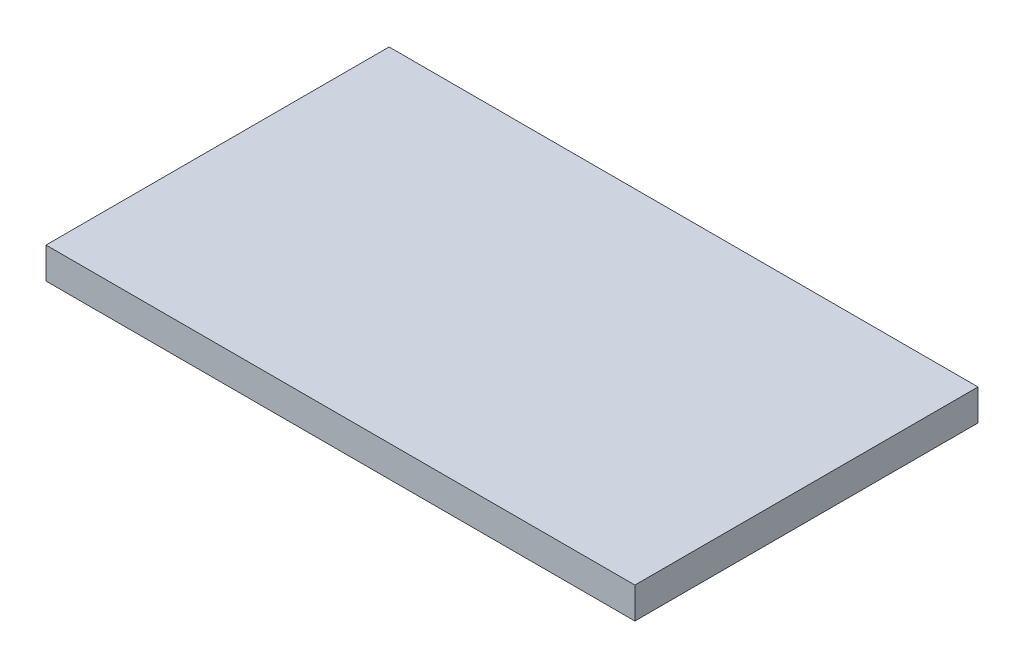
ISO-10303-21;
HEADER;
FILE_DESCRIPTION(('STEP AP214'),'2;1');
FILE_NAME('part.step','',(''),(''),'','','');
FILE_SCHEMA(('AUTOMOTIVE_DESIGN { 1 0 10303 214 1 1 1 1 }'));
ENDSEC;
DATA;
#1=APPLICATION_CONTEXT('core data for automotive mechanical design processes');
#2=APPLICATION_PROTOCOL_DEFINITION('international standard','automotive_design',2000,#1);
#3=PRODUCT_CONTEXT('',#1,'mechanical');
#4=PRODUCT('Part','Part','',(#3));
#5=PRODUCT_RELATED_PRODUCT_CATEGORY('part','',(#4));
#6=PRODUCT_DEFINITION_FORMATION('','',#4);
#7=PRODUCT_DEFINITION_CONTEXT('part definition',#1,'design');
#8=PRODUCT_DEFINITION('design','',#6,#7);
#9=PRODUCT_DEFINITION_SHAPE('','',#8);
#10=(LENGTH_UNIT() NAMED_UNIT(*) SI_UNIT(.MILLI.,.METRE.));
#11=(NAMED_UNIT(*) PLANE_ANGLE_UNIT() SI_UNIT($,.RADIAN.));
#12=(NAMED_UNIT(*) SI_UNIT($,.STERADIAN.) SOLID_ANGLE_UNIT());
#13=UNCERTAINTY_MEASURE_WITH_UNIT(LENGTH_MEASURE(1.E-05),#10,'distance_accuracy_value','');
#14=(GEOMETRIC_REPRESENTATION_CONTEXT(3) GLOBAL_UNCERTAINTY_ASSIGNED_CONTEXT((#13)) GLOBAL_UNIT_ASSIGNED_CONTEXT((#10,
#11,#12)) REPRESENTATION_CONTEXT('',''));
#15=CARTESIAN_POINT('',(0.,0.,0.));
#16=DIRECTION('',(0.,0.,1.));
#17=DIRECTION('',(1.,0.,0.));
#18=AXIS2_PLACEMENT_3D('',#15,#16,#17);
#19=CARTESIAN_POINT('',(299.72,15.875,174.625));
#20=DIRECTION('',(0.,0.,-1.));
#21=DIRECTION('',(-1.,0.,0.));
#22=AXIS2_PLACEMENT_3D('',#19,#20,#21);
#23=PLANE('',#22);
#24=DIRECTION('',(0.,-1.,0.));
#25=VECTOR('',#24,1.);
#26=CARTESIAN_POINT('',(-299.72,15.875,174.625));
#27=LINE('',#26,#25);
#28=CARTESIAN_POINT('',(-299.72,15.875,174.625));
#29=VERTEX_POINT('',#28);
#30=CARTESIAN_POINT('',(-299.72,-15.875,174.625));
#31=VERTEX_POINT('',#30);
#32=EDGE_CURVE('E113',#29,#31,#27,.T.);
#33=ORIENTED_EDGE('',*,*,#32,.T.);
#34=DIRECTION('',(-1.,0.,0.));
#35=VECTOR('',#34,1.);
#36=CARTESIAN_POINT('',(299.72,-15.875,174.625));
#37=LINE('',#36,#35);
#38=CARTESIAN_POINT('',(299.72,-15.875,174.625));
#39=VERTEX_POINT('',#38);
#40=EDGE_CURVE('E11',#39,#31,#37,.T.);
#41=ORIENTED_EDGE('',*,*,#40,.F.);
#42=DIRECTION('',(0.,-1.,0.));
#43=VECTOR('',#42,1.);
#44=CARTESIAN_POINT('',(299.72,15.875,174.625));
#45=LINE('',#44,#43);
#46=CARTESIAN_POINT('',(299.72,15.875,174.625));
#47=VERTEX_POINT('',#46);
#48=EDGE_CURVE('E97',#47,#39,#45,.T.);
#49=ORIENTED_EDGE('',*,*,#48,.F.);
#50=DIRECTION('',(-1.,0.,0.));
#51=VECTOR('',#50,1.);
#52=CARTESIAN_POINT('',(299.72,15.875,174.625));
#53=LINE('',#52,#51);
#54=EDGE_CURVE('E109',#47,#29,#53,.T.);
#55=ORIENTED_EDGE('',*,*,#54,.T.);
#56=EDGE_LOOP('',(#33,#41,#49,#55));
#57=FACE_BOUND('',#56,.T.);
#58=ADVANCED_FACE('F45',(#57),#23,.F.);
#59=CARTESIAN_POINT('',(299.72,-15.875,174.625));
#60=DIRECTION('',(0.,1.,0.));
#61=DIRECTION('',(0.,0.,1.));
#62=AXIS2_PLACEMENT_3D('',#59,#60,#61);
#63=PLANE('',#62);
#64=DIRECTION('',(0.,0.,-1.));
#65=VECTOR('',#64,1.);
#66=CARTESIAN_POINT('',(-299.72,-15.875,174.625));
#67=LINE('',#66,#65);
#68=CARTESIAN_POINT('',(-299.72,-15.875,-174.625));
#69=VERTEX_POINT('',#68);
#70=EDGE_CURVE('E102',#31,#69,#67,.T.);
#71=ORIENTED_EDGE('',*,*,#70,.T.);
#72=DIRECTION('',(-1.,0.,0.));
#73=VECTOR('',#72,1.);
#74=CARTESIAN_POINT('',(299.72,-15.875,-174.625));
#75=LINE('',#74,#73);
#76=CARTESIAN_POINT('',(299.72,-15.875,-174.625));
#77=VERTEX_POINT('',#76);
#78=EDGE_CURVE('E54',#77,#69,#75,.T.);
#79=ORIENTED_EDGE('',*,*,#78,.F.);
#80=DIRECTION('',(0.,0.,-1.));
#81=VECTOR('',#80,1.);
#82=CARTESIAN_POINT('',(299.72,-15.875,174.625));
#83=LINE('',#82,#81);
#84=EDGE_CURVE('E92',#39,#77,#83,.T.);
#85=ORIENTED_EDGE('',*,*,#84,.F.);
#86=ORIENTED_EDGE('',*,*,#40,.T.);
#87=EDGE_LOOP('',(#71,#79,#85,#86));
#88=FACE_BOUND('',#87,.T.);
#89=ADVANCED_FACE('F101',(#88),#63,.F.);
#90=CARTESIAN_POINT('',(299.72,15.875,-174.625));
#91=DIRECTION('',(0.,0.,1.));
#92=DIRECTION('',(1.,0.,0.));
#93=AXIS2_PLACEMENT_3D('',#90,#91,#92);
#94=PLANE('',#93);
#95=DIRECTION('',(0.,1.,0.));
#96=VECTOR('',#95,1.);
#97=CARTESIAN_POINT('',(-299.72,15.875,-174.625));
#98=LINE('',#97,#96);
#99=CARTESIAN_POINT('',(-299.72,15.875,-174.625));
#100=VERTEX_POINT('',#99);
#101=EDGE_CURVE('E79',#69,#100,#98,.T.);
#102=ORIENTED_EDGE('',*,*,#101,.T.);
#103=DIRECTION('',(-1.,0.,0.));
#104=VECTOR('',#103,1.);
#105=CARTESIAN_POINT('',(299.72,15.875,-174.625));
#106=LINE('',#105,#104);
#107=CARTESIAN_POINT('',(299.72,15.875,-174.625));
#108=VERTEX_POINT('',#107);
#109=EDGE_CURVE('E104',#108,#100,#106,.T.);
#110=ORIENTED_EDGE('',*,*,#109,.F.);
#111=DIRECTION('',(0.,1.,0.));
#112=VECTOR('',#111,1.);
#113=CARTESIAN_POINT('',(299.72,15.875,-174.625));
#114=LINE('',#113,#112);
#115=EDGE_CURVE('E95',#77,#108,#114,.T.);
#116=ORIENTED_EDGE('',*,*,#115,.F.);
#117=ORIENTED_EDGE('',*,*,#78,.T.);
#118=EDGE_LOOP('',(#102,#110,#116,#117));
#119=FACE_BOUND('',#118,.T.);
#120=ADVANCED_FACE('F105',(#119),#94,.F.);
#121=CARTESIAN_POINT('',(299.72,15.875,174.625));
#122=DIRECTION('',(0.,-1.,0.));
#123=DIRECTION('',(0.,0.,-1.));
#124=AXIS2_PLACEMENT_3D('',#121,#122,#123);
#125=PLANE('',#124);
#126=DIRECTION('',(0.,0.,1.));
#127=VECTOR('',#126,1.);
#128=CARTESIAN_POINT('',(-299.72,15.875,174.625));
#129=LINE('',#128,#127);
#130=EDGE_CURVE('E85',#100,#29,#129,.T.);
#131=ORIENTED_EDGE('',*,*,#130,.T.);
#132=ORIENTED_EDGE('',*,*,#54,.F.);
#133=DIRECTION('',(0.,0.,1.));
#134=VECTOR('',#133,1.);
#135=CARTESIAN_POINT('',(299.72,15.875,174.625));
#136=LINE('',#135,#134);
#137=EDGE_CURVE('E62',#108,#47,#136,.T.);
#138=ORIENTED_EDGE('',*,*,#137,.F.);
#139=ORIENTED_EDGE('',*,*,#109,.T.);
#140=EDGE_LOOP('',(#131,#132,#138,#139));
#141=FACE_BOUND('',#140,.T.);
#142=ADVANCED_FACE('F126',(#141),#125,.F.);
#143=CARTESIAN_POINT('',(299.72,0.,0.));
#144=DIRECTION('',(1.,0.,0.));
#145=DIRECTION('',(0.,0.,-1.));
#146=AXIS2_PLACEMENT_3D('',#143,#144,#145);
#147=PLANE('',#146);
#148=ORIENTED_EDGE('',*,*,#48,.T.);
#149=ORIENTED_EDGE('',*,*,#84,.T.);
#150=ORIENTED_EDGE('',*,*,#115,.T.);
#151=ORIENTED_EDGE('',*,*,#137,.T.);
#152=EDGE_LOOP('',(#148,#149,#150,#151));
#153=FACE_BOUND('',#152,.T.);
#154=ADVANCED_FACE('F93',(#153),#147,.T.);
#155=CARTESIAN_POINT('',(-299.72,0.,0.));
#156=DIRECTION('',(1.,0.,0.));
#157=DIRECTION('',(0.,0.,-1.));
#158=AXIS2_PLACEMENT_3D('',#155,#156,#157);
#159=PLANE('',#158);
#160=ORIENTED_EDGE('',*,*,#32,.F.);
#161=ORIENTED_EDGE('',*,*,#130,.F.);
#162=ORIENTED_EDGE('',*,*,#101,.F.);
#163=ORIENTED_EDGE('',*,*,#70,.F.);
#164=EDGE_LOOP('',(#160,#161,#162,#163));
#165=FACE_BOUND('',#164,.T.);
#166=ADVANCED_FACE('F129',(#165),#159,.F.);
#167=CLOSED_SHELL('',(#58,#89,#120,#142,#154,#166));
#168=MANIFOLD_SOLID_BREP('B2',#167);
#169=ADVANCED_BREP_SHAPE_REPRESENTATION('',(#18,#168),#14);
#170=SHAPE_DEFINITION_REPRESENTATION(#9,#169);
ENDSEC;
END-ISO-10303-21;
